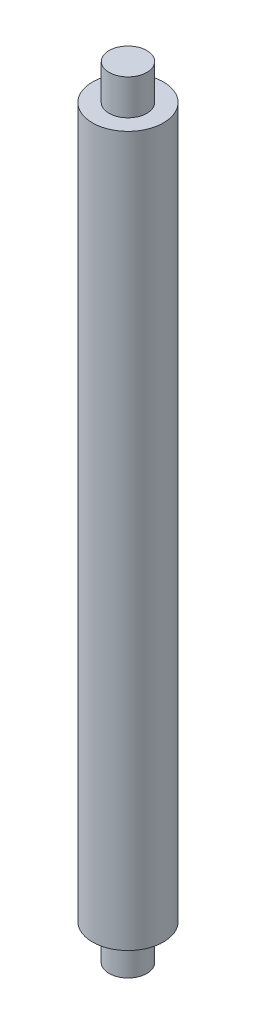
ISO-10303-21;
HEADER;
FILE_DESCRIPTION(('STEP AP214'),'2;1');
FILE_NAME('part.step','',(''),(''),'','','');
FILE_SCHEMA(('AUTOMOTIVE_DESIGN { 1 0 10303 214 1 1 1 1 }'));
ENDSEC;
DATA;
#1=APPLICATION_CONTEXT('core data for automotive mechanical design processes');
#2=APPLICATION_PROTOCOL_DEFINITION('international standard','automotive_design',2000,#1);
#3=PRODUCT_CONTEXT('',#1,'mechanical');
#4=PRODUCT('Part','Part','',(#3));
#5=PRODUCT_RELATED_PRODUCT_CATEGORY('part','',(#4));
#6=PRODUCT_DEFINITION_FORMATION('','',#4);
#7=PRODUCT_DEFINITION_CONTEXT('part definition',#1,'design');
#8=PRODUCT_DEFINITION('design','',#6,#7);
#9=PRODUCT_DEFINITION_SHAPE('','',#8);
#10=(LENGTH_UNIT() NAMED_UNIT(*) SI_UNIT(.MILLI.,.METRE.));
#11=(NAMED_UNIT(*) PLANE_ANGLE_UNIT() SI_UNIT($,.RADIAN.));
#12=(NAMED_UNIT(*) SI_UNIT($,.STERADIAN.) SOLID_ANGLE_UNIT());
#13=UNCERTAINTY_MEASURE_WITH_UNIT(LENGTH_MEASURE(1.E-05),#10,'distance_accuracy_value','');
#14=(GEOMETRIC_REPRESENTATION_CONTEXT(3) GLOBAL_UNCERTAINTY_ASSIGNED_CONTEXT((#13)) GLOBAL_UNIT_ASSIGNED_CONTEXT((#10,
#11,#12)) REPRESENTATION_CONTEXT('',''));
#15=CARTESIAN_POINT('',(0.,0.,0.));
#16=DIRECTION('',(0.,0.,1.));
#17=DIRECTION('',(1.,0.,0.));
#18=AXIS2_PLACEMENT_3D('',#15,#16,#17);
#19=CARTESIAN_POINT('',(0.,3.,0.));
#20=DIRECTION('',(0.,-1.,0.));
#21=DIRECTION('',(0.,0.,-1.));
#22=AXIS2_PLACEMENT_3D('',#19,#20,#21);
#23=CYLINDRICAL_SURFACE('',#22,1.6);
#24=CARTESIAN_POINT('',(0.,3.,0.));
#25=DIRECTION('',(0.,1.,0.));
#26=DIRECTION('',(0.,0.,1.));
#27=AXIS2_PLACEMENT_3D('',#24,#25,#26);
#28=CIRCLE('',#27,1.6);
#29=CARTESIAN_POINT('',(0.,3.,1.6));
#30=VERTEX_POINT('',#29);
#31=EDGE_CURVE('E10',#30,#30,#28,.T.);
#32=ORIENTED_EDGE('',*,*,#31,.F.);
#33=EDGE_LOOP('',(#32));
#34=FACE_BOUND('',#33,.T.);
#35=CARTESIAN_POINT('',(0.,0.,0.));
#36=DIRECTION('',(0.,1.,0.));
#37=DIRECTION('',(0.,0.,1.));
#38=AXIS2_PLACEMENT_3D('',#35,#36,#37);
#39=CIRCLE('',#38,1.6);
#40=CARTESIAN_POINT('',(0.,0.,1.6));
#41=VERTEX_POINT('',#40);
#42=EDGE_CURVE('E34',#41,#41,#39,.T.);
#43=ORIENTED_EDGE('',*,*,#42,.T.);
#44=EDGE_LOOP('',(#43));
#45=FACE_BOUND('',#44,.T.);
#46=ADVANCED_FACE('F31',(#34,#45),#23,.T.);
#47=CARTESIAN_POINT('',(0.,0.,0.));
#48=DIRECTION('',(0.,1.,0.));
#49=DIRECTION('',(0.,0.,1.));
#50=AXIS2_PLACEMENT_3D('',#47,#48,#49);
#51=PLANE('',#50);
#52=ORIENTED_EDGE('',*,*,#42,.F.);
#53=EDGE_LOOP('',(#52));
#54=FACE_BOUND('',#53,.T.);
#55=ADVANCED_FACE('F73',(#54),#51,.F.);
#56=CARTESIAN_POINT('',(0.,63.,0.));
#57=DIRECTION('',(0.,-1.,0.));
#58=DIRECTION('',(0.,0.,-1.));
#59=AXIS2_PLACEMENT_3D('',#56,#57,#58);
#60=CYLINDRICAL_SURFACE('',#59,3.);
#61=CARTESIAN_POINT('',(0.,63.,0.));
#62=DIRECTION('',(0.,1.,0.));
#63=DIRECTION('',(0.,0.,1.));
#64=AXIS2_PLACEMENT_3D('',#61,#62,#63);
#65=CIRCLE('',#64,3.);
#66=CARTESIAN_POINT('',(0.,63.,3.));
#67=VERTEX_POINT('',#66);
#68=EDGE_CURVE('E41',#67,#67,#65,.T.);
#69=ORIENTED_EDGE('',*,*,#68,.F.);
#70=EDGE_LOOP('',(#69));
#71=FACE_BOUND('',#70,.T.);
#72=CARTESIAN_POINT('',(0.,3.,0.));
#73=DIRECTION('',(0.,1.,0.));
#74=DIRECTION('',(0.,0.,1.));
#75=AXIS2_PLACEMENT_3D('',#72,#73,#74);
#76=CIRCLE('',#75,3.);
#77=CARTESIAN_POINT('',(0.,3.,3.));
#78=VERTEX_POINT('',#77);
#79=EDGE_CURVE('E43',#78,#78,#76,.T.);
#80=ORIENTED_EDGE('',*,*,#79,.T.);
#81=EDGE_LOOP('',(#80));
#82=FACE_BOUND('',#81,.T.);
#83=ADVANCED_FACE('F67',(#71,#82),#60,.T.);
#84=CARTESIAN_POINT('',(0.,63.,0.));
#85=DIRECTION('',(0.,1.,0.));
#86=DIRECTION('',(0.,0.,1.));
#87=AXIS2_PLACEMENT_3D('',#84,#85,#86);
#88=PLANE('',#87);
#89=CARTESIAN_POINT('',(0.,63.,0.));
#90=DIRECTION('',(0.,1.,0.));
#91=DIRECTION('',(0.,0.,1.));
#92=AXIS2_PLACEMENT_3D('',#89,#90,#91);
#93=CIRCLE('',#92,1.6);
#94=CARTESIAN_POINT('',(0.,63.,1.6));
#95=VERTEX_POINT('',#94);
#96=EDGE_CURVE('E49',#95,#95,#93,.T.);
#97=ORIENTED_EDGE('',*,*,#96,.F.);
#98=EDGE_LOOP('',(#97));
#99=FACE_BOUND('',#98,.T.);
#100=ORIENTED_EDGE('',*,*,#68,.T.);
#101=EDGE_LOOP('',(#100));
#102=FACE_BOUND('',#101,.T.);
#103=ADVANCED_FACE('F64',(#99,#102),#88,.T.);
#104=CARTESIAN_POINT('',(0.,3.,0.));
#105=DIRECTION('',(0.,1.,0.));
#106=DIRECTION('',(0.,0.,1.));
#107=AXIS2_PLACEMENT_3D('',#104,#105,#106);
#108=PLANE('',#107);
#109=ORIENTED_EDGE('',*,*,#31,.T.);
#110=EDGE_LOOP('',(#109));
#111=FACE_BOUND('',#110,.T.);
#112=ORIENTED_EDGE('',*,*,#79,.F.);
#113=EDGE_LOOP('',(#112));
#114=FACE_BOUND('',#113,.T.);
#115=ADVANCED_FACE('F60',(#111,#114),#108,.F.);
#116=CARTESIAN_POINT('',(0.,66.,0.));
#117=DIRECTION('',(0.,-1.,0.));
#118=DIRECTION('',(0.,0.,-1.));
#119=AXIS2_PLACEMENT_3D('',#116,#117,#118);
#120=CYLINDRICAL_SURFACE('',#119,1.6);
#121=CARTESIAN_POINT('',(0.,66.,0.));
#122=DIRECTION('',(0.,1.,0.));
#123=DIRECTION('',(0.,0.,1.));
#124=AXIS2_PLACEMENT_3D('',#121,#122,#123);
#125=CIRCLE('',#124,1.6);
#126=CARTESIAN_POINT('',(0.,66.,1.6));
#127=VERTEX_POINT('',#126);
#128=EDGE_CURVE('E46',#127,#127,#125,.T.);
#129=ORIENTED_EDGE('',*,*,#128,.F.);
#130=EDGE_LOOP('',(#129));
#131=FACE_BOUND('',#130,.T.);
#132=ORIENTED_EDGE('',*,*,#96,.T.);
#133=EDGE_LOOP('',(#132));
#134=FACE_BOUND('',#133,.T.);
#135=ADVANCED_FACE('F57',(#131,#134),#120,.T.);
#136=CARTESIAN_POINT('',(0.,66.,0.));
#137=DIRECTION('',(0.,1.,0.));
#138=DIRECTION('',(0.,0.,1.));
#139=AXIS2_PLACEMENT_3D('',#136,#137,#138);
#140=PLANE('',#139);
#141=ORIENTED_EDGE('',*,*,#128,.T.);
#142=EDGE_LOOP('',(#141));
#143=FACE_BOUND('',#142,.T.);
#144=ADVANCED_FACE('F55',(#143),#140,.T.);
#145=CLOSED_SHELL('',(#46,#55,#83,#103,#115,#135,#144));
#146=MANIFOLD_SOLID_BREP('B2',#145);
#147=ADVANCED_BREP_SHAPE_REPRESENTATION('',(#18,#146),#14);
#148=SHAPE_DEFINITION_REPRESENTATION(#9,#147);
ENDSEC;
END-ISO-10303-21;
